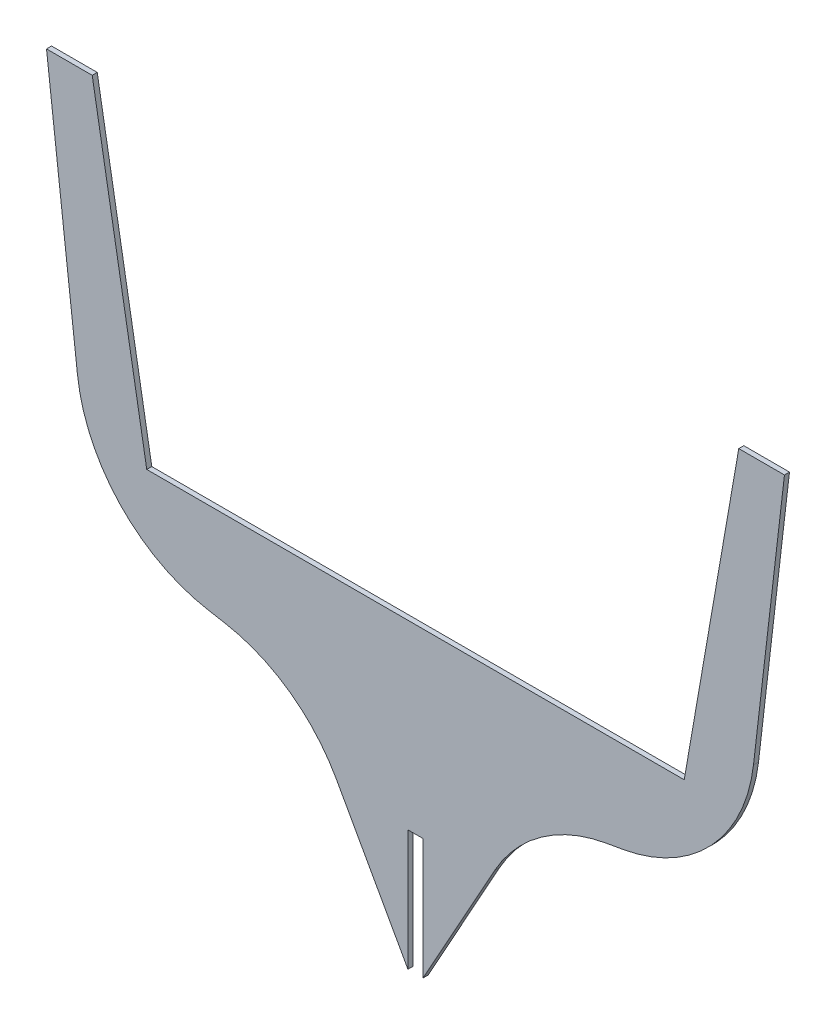
ISO-10303-21;
HEADER;
FILE_DESCRIPTION(('STEP AP214'),'2;1');
FILE_NAME('part.step','',(''),(''),'','','');
FILE_SCHEMA(('AUTOMOTIVE_DESIGN { 1 0 10303 214 1 1 1 1 }'));
ENDSEC;
DATA;
#1=APPLICATION_CONTEXT('core data for automotive mechanical design processes');
#2=APPLICATION_PROTOCOL_DEFINITION('international standard','automotive_design',2000,#1);
#3=PRODUCT_CONTEXT('',#1,'mechanical');
#4=PRODUCT('Part','Part','',(#3));
#5=PRODUCT_RELATED_PRODUCT_CATEGORY('part','',(#4));
#6=PRODUCT_DEFINITION_FORMATION('','',#4);
#7=PRODUCT_DEFINITION_CONTEXT('part definition',#1,'design');
#8=PRODUCT_DEFINITION('design','',#6,#7);
#9=PRODUCT_DEFINITION_SHAPE('','',#8);
#10=(LENGTH_UNIT() NAMED_UNIT(*) SI_UNIT(.MILLI.,.METRE.));
#11=(NAMED_UNIT(*) PLANE_ANGLE_UNIT() SI_UNIT($,.RADIAN.));
#12=(NAMED_UNIT(*) SI_UNIT($,.STERADIAN.) SOLID_ANGLE_UNIT());
#13=UNCERTAINTY_MEASURE_WITH_UNIT(LENGTH_MEASURE(1.E-05),#10,'distance_accuracy_value','');
#14=(GEOMETRIC_REPRESENTATION_CONTEXT(3) GLOBAL_UNCERTAINTY_ASSIGNED_CONTEXT((#13)) GLOBAL_UNIT_ASSIGNED_CONTEXT((#10,
#11,#12)) REPRESENTATION_CONTEXT('',''));
#15=CARTESIAN_POINT('',(0.,0.,0.));
#16=DIRECTION('',(0.,0.,1.));
#17=DIRECTION('',(1.,0.,0.));
#18=AXIS2_PLACEMENT_3D('',#15,#16,#17);
#19=CARTESIAN_POINT('',(209.958428132629,-244.056419552194,3.));
#20=DIRECTION('',(1.,0.,0.));
#21=DIRECTION('',(0.,0.,-1.));
#22=AXIS2_PLACEMENT_3D('',#19,#20,#21);
#23=PLANE('',#22);
#24=DIRECTION('',(0.,-1.,0.));
#25=VECTOR('',#24,1.);
#26=CARTESIAN_POINT('',(209.958428132629,-244.056419552194,0.));
#27=LINE('',#26,#25);
#28=CARTESIAN_POINT('',(209.958428132629,-172.056419552194,0.));
#29=VERTEX_POINT('',#28);
#30=CARTESIAN_POINT('',(209.958428132629,-244.056419552194,0.));
#31=VERTEX_POINT('',#30);
#32=EDGE_CURVE('E184',#29,#31,#27,.T.);
#33=ORIENTED_EDGE('',*,*,#32,.T.);
#34=DIRECTION('',(0.,0.,-1.));
#35=VECTOR('',#34,1.);
#36=CARTESIAN_POINT('',(209.958428132629,-244.056419552194,3.));
#37=LINE('',#36,#35);
#38=CARTESIAN_POINT('',(209.958428132629,-244.056419552194,3.));
#39=VERTEX_POINT('',#38);
#40=EDGE_CURVE('E165',#39,#31,#37,.T.);
#41=ORIENTED_EDGE('',*,*,#40,.F.);
#42=DIRECTION('',(0.,-1.,0.));
#43=VECTOR('',#42,1.);
#44=CARTESIAN_POINT('',(209.958428132629,-244.056419552194,3.));
#45=LINE('',#44,#43);
#46=CARTESIAN_POINT('',(209.958428132629,-172.056419552194,3.));
#47=VERTEX_POINT('',#46);
#48=EDGE_CURVE('E171',#47,#39,#45,.T.);
#49=ORIENTED_EDGE('',*,*,#48,.F.);
#50=DIRECTION('',(0.,0.,-1.));
#51=VECTOR('',#50,1.);
#52=CARTESIAN_POINT('',(209.958428132629,-172.056419552194,3.));
#53=LINE('',#52,#51);
#54=EDGE_CURVE('E252',#47,#29,#53,.T.);
#55=ORIENTED_EDGE('',*,*,#54,.T.);
#56=EDGE_LOOP('',(#33,#41,#49,#55));
#57=FACE_BOUND('',#56,.T.);
#58=ADVANCED_FACE('F35',(#57),#23,.F.);
#59=CARTESIAN_POINT('',(274.580781980399,-127.690915138883,3.));
#60=DIRECTION('',(-0.874237473677519,0.485498547493141,0.));
#61=DIRECTION('',(-0.485498547493141,-0.874237473677519,0.));
#62=AXIS2_PLACEMENT_3D('',#59,#60,#61);
#63=PLANE('',#62);
#64=DIRECTION('',(0.485498547493141,0.874237473677518,0.));
#65=VECTOR('',#64,1.);
#66=CARTESIAN_POINT('',(274.580781980399,-127.690915138883,0.));
#67=LINE('',#66,#65);
#68=CARTESIAN_POINT('',(252.603248255427,-167.265870945839,0.));
#69=VERTEX_POINT('',#68);
#70=EDGE_CURVE('E254',#31,#69,#67,.T.);
#71=ORIENTED_EDGE('',*,*,#70,.T.);
#72=DIRECTION('',(0.,0.,-1.));
#73=VECTOR('',#72,1.);
#74=CARTESIAN_POINT('',(252.603248255427,-167.265870945839,3.));
#75=LINE('',#74,#73);
#76=CARTESIAN_POINT('',(252.603248255427,-167.265870945839,3.));
#77=VERTEX_POINT('',#76);
#78=EDGE_CURVE('E168',#69,#77,#75,.F.);
#79=ORIENTED_EDGE('',*,*,#78,.T.);
#80=DIRECTION('',(0.485498547493141,0.874237473677518,0.));
#81=VECTOR('',#80,1.);
#82=CARTESIAN_POINT('',(274.580781980399,-127.690915138883,3.));
#83=LINE('',#82,#81);
#84=EDGE_CURVE('E160',#39,#77,#83,.T.);
#85=ORIENTED_EDGE('',*,*,#84,.F.);
#86=ORIENTED_EDGE('',*,*,#40,.T.);
#87=EDGE_LOOP('',(#71,#79,#85,#86));
#88=FACE_BOUND('',#87,.T.);
#89=ADVANCED_FACE('F163',(#88),#63,.F.);
#90=CARTESIAN_POINT('',(398.831601009363,-105.784832074239,3.));
#91=DIRECTION('',(-0.173627509558634,0.984811397133718,0.));
#92=DIRECTION('',(-0.984811397133718,-0.173627509558634,0.));
#93=AXIS2_PLACEMENT_3D('',#90,#91,#92);
#94=PLANE('',#93);
#95=DIRECTION('',(0.984811397133718,0.173627509558634,0.));
#96=VECTOR('',#95,1.);
#97=CARTESIAN_POINT('',(398.831601009363,-105.784832074239,0.));
#98=LINE('',#97,#96);
#99=CARTESIAN_POINT('',(319.161194846721,-119.831150229984,0.));
#100=VERTEX_POINT('',#99);
#101=CARTESIAN_POINT('',(329.127406381608,-118.074053903141,0.));
#102=VERTEX_POINT('',#101);
#103=EDGE_CURVE('E256',#100,#102,#98,.T.);
#104=ORIENTED_EDGE('',*,*,#103,.T.);
#105=DIRECTION('',(0.,0.,-1.));
#106=VECTOR('',#105,1.);
#107=CARTESIAN_POINT('',(329.127406381608,-118.074053903141,3.));
#108=LINE('',#107,#106);
#109=CARTESIAN_POINT('',(329.127406381608,-118.074053903141,3.));
#110=VERTEX_POINT('',#109);
#111=EDGE_CURVE('E202',#102,#110,#108,.F.);
#112=ORIENTED_EDGE('',*,*,#111,.T.);
#113=DIRECTION('',(0.984811397133718,0.173627509558634,0.));
#114=VECTOR('',#113,1.);
#115=CARTESIAN_POINT('',(398.831601009363,-105.784832074239,3.));
#116=LINE('',#115,#114);
#117=CARTESIAN_POINT('',(319.161194846721,-119.831150229984,3.));
#118=VERTEX_POINT('',#117);
#119=EDGE_CURVE('E170',#118,#110,#116,.T.);
#120=ORIENTED_EDGE('',*,*,#119,.F.);
#121=DIRECTION('',(0.,0.,-1.));
#122=VECTOR('',#121,1.);
#123=CARTESIAN_POINT('',(319.161194846721,-119.831150229984,0.));
#124=LINE('',#123,#122);
#125=EDGE_CURVE('E199',#118,#100,#124,.T.);
#126=ORIENTED_EDGE('',*,*,#125,.T.);
#127=EDGE_LOOP('',(#104,#112,#120,#126));
#128=FACE_BOUND('',#127,.T.);
#129=ADVANCED_FACE('F347',(#128),#94,.F.);
#130=CARTESIAN_POINT('',(425.458428132629,123.443580447806,3.));
#131=DIRECTION('',(-0.993321114307734,0.115382684448063,0.));
#132=DIRECTION('',(-0.115382684448063,-0.993321114307734,0.));
#133=AXIS2_PLACEMENT_3D('',#130,#131,#132);
#134=PLANE('',#133);
#135=DIRECTION('',(0.115382684448063,0.993321114307734,0.));
#136=VECTOR('',#135,1.);
#137=CARTESIAN_POINT('',(425.458428132629,123.443580447806,3.));
#138=LINE('',#137,#136);
#139=CARTESIAN_POINT('',(406.998298832773,-35.4783261980038,3.));
#140=VERTEX_POINT('',#139);
#141=CARTESIAN_POINT('',(425.458428132629,123.443580447806,3.));
#142=VERTEX_POINT('',#141);
#143=EDGE_CURVE('E508',#140,#142,#138,.T.);
#144=ORIENTED_EDGE('',*,*,#143,.F.);
#145=DIRECTION('',(0.,0.,-1.));
#146=VECTOR('',#145,1.);
#147=CARTESIAN_POINT('',(406.998298832773,-35.4783261980038,3.));
#148=LINE('',#147,#146);
#149=CARTESIAN_POINT('',(406.998298832773,-35.4783261980038,0.));
#150=VERTEX_POINT('',#149);
#151=EDGE_CURVE('E185',#140,#150,#148,.T.);
#152=ORIENTED_EDGE('',*,*,#151,.T.);
#153=DIRECTION('',(0.115382684448063,0.993321114307734,0.));
#154=VECTOR('',#153,1.);
#155=CARTESIAN_POINT('',(425.458428132629,123.443580447806,0.));
#156=LINE('',#155,#154);
#157=CARTESIAN_POINT('',(425.458428132629,123.443580447806,0.));
#158=VERTEX_POINT('',#157);
#159=EDGE_CURVE('E259',#150,#158,#156,.T.);
#160=ORIENTED_EDGE('',*,*,#159,.T.);
#161=DIRECTION('',(0.,0.,-1.));
#162=VECTOR('',#161,1.);
#163=CARTESIAN_POINT('',(425.458428132629,123.443580447806,3.));
#164=LINE('',#163,#162);
#165=EDGE_CURVE('E186',#142,#158,#164,.T.);
#166=ORIENTED_EDGE('',*,*,#165,.F.);
#167=EDGE_LOOP('',(#144,#152,#160,#166));
#168=FACE_BOUND('',#167,.T.);
#169=ADVANCED_FACE('F430',(#168),#134,.F.);
#170=CARTESIAN_POINT('',(425.458428132629,123.443580447806,3.));
#171=DIRECTION('',(0.,-1.,0.));
#172=DIRECTION('',(1.,0.,0.));
#173=AXIS2_PLACEMENT_3D('',#170,#171,#172);
#174=PLANE('',#173);
#175=DIRECTION('',(-1.,0.,0.));
#176=VECTOR('',#175,1.);
#177=CARTESIAN_POINT('',(425.458428132629,123.443580447806,0.));
#178=LINE('',#177,#176);
#179=CARTESIAN_POINT('',(398.210919070476,123.443580447806,0.));
#180=VERTEX_POINT('',#179);
#181=EDGE_CURVE('E261',#158,#180,#178,.T.);
#182=ORIENTED_EDGE('',*,*,#181,.T.);
#183=DIRECTION('',(0.,0.,-1.));
#184=VECTOR('',#183,1.);
#185=CARTESIAN_POINT('',(398.210919070476,123.443580447806,3.));
#186=LINE('',#185,#184);
#187=CARTESIAN_POINT('',(398.210919070476,123.443580447806,3.));
#188=VERTEX_POINT('',#187);
#189=EDGE_CURVE('E192',#188,#180,#186,.T.);
#190=ORIENTED_EDGE('',*,*,#189,.F.);
#191=DIRECTION('',(-1.,0.,0.));
#192=VECTOR('',#191,1.);
#193=CARTESIAN_POINT('',(425.458428132629,123.443580447806,3.));
#194=LINE('',#193,#192);
#195=EDGE_CURVE('E506',#142,#188,#194,.T.);
#196=ORIENTED_EDGE('',*,*,#195,.F.);
#197=ORIENTED_EDGE('',*,*,#165,.T.);
#198=EDGE_LOOP('',(#182,#190,#196,#197));
#199=FACE_BOUND('',#198,.T.);
#200=ADVANCED_FACE('F435',(#199),#174,.F.);
#201=CARTESIAN_POINT('',(398.210919070476,123.443580447806,3.));
#202=DIRECTION('',(0.985248404363814,-0.171130306195482,0.));
#203=DIRECTION('',(0.171130306195482,0.985248404363814,0.));
#204=AXIS2_PLACEMENT_3D('',#201,#202,#203);
#205=PLANE('',#204);
#206=DIRECTION('',(-0.171130306195482,-0.985248404363813,0.));
#207=VECTOR('',#206,1.);
#208=CARTESIAN_POINT('',(398.210919070476,123.443580447806,0.));
#209=LINE('',#208,#207);
#210=CARTESIAN_POINT('',(365.682670580279,-63.8312841521944,0.));
#211=VERTEX_POINT('',#210);
#212=EDGE_CURVE('E263',#180,#211,#209,.T.);
#213=ORIENTED_EDGE('',*,*,#212,.T.);
#214=DIRECTION('',(0.,0.,-1.));
#215=VECTOR('',#214,1.);
#216=CARTESIAN_POINT('',(365.682670580279,-63.8312841521944,3.));
#217=LINE('',#216,#215);
#218=CARTESIAN_POINT('',(365.682670580279,-63.8312841521944,3.));
#219=VERTEX_POINT('',#218);
#220=EDGE_CURVE('E291',#219,#211,#217,.T.);
#221=ORIENTED_EDGE('',*,*,#220,.F.);
#222=DIRECTION('',(-0.171130306195482,-0.985248404363813,0.));
#223=VECTOR('',#222,1.);
#224=CARTESIAN_POINT('',(398.210919070476,123.443580447806,3.));
#225=LINE('',#224,#223);
#226=EDGE_CURVE('E300',#188,#219,#225,.T.);
#227=ORIENTED_EDGE('',*,*,#226,.F.);
#228=ORIENTED_EDGE('',*,*,#189,.T.);
#229=EDGE_LOOP('',(#213,#221,#227,#228));
#230=FACE_BOUND('',#229,.T.);
#231=ADVANCED_FACE('F298',(#230),#205,.F.);
#232=CARTESIAN_POINT('',(45.2341856849782,-63.8312841521944,3.));
#233=DIRECTION('',(0.,-1.,0.));
#234=DIRECTION('',(0.,0.,-1.));
#235=AXIS2_PLACEMENT_3D('',#232,#233,#234);
#236=PLANE('',#235);
#237=DIRECTION('',(-1.,0.,0.));
#238=VECTOR('',#237,1.);
#239=CARTESIAN_POINT('',(45.2341856849782,-63.8312841521944,0.));
#240=LINE('',#239,#238);
#241=CARTESIAN_POINT('',(45.2341856849782,-63.8312841521944,0.));
#242=VERTEX_POINT('',#241);
#243=EDGE_CURVE('E265',#211,#242,#240,.T.);
#244=ORIENTED_EDGE('',*,*,#243,.T.);
#245=DIRECTION('',(0.,0.,-1.));
#246=VECTOR('',#245,1.);
#247=CARTESIAN_POINT('',(45.2341856849782,-63.8312841521944,3.));
#248=LINE('',#247,#246);
#249=CARTESIAN_POINT('',(45.2341856849782,-63.8312841521944,3.));
#250=VERTEX_POINT('',#249);
#251=EDGE_CURVE('E288',#250,#242,#248,.T.);
#252=ORIENTED_EDGE('',*,*,#251,.F.);
#253=DIRECTION('',(-1.,0.,0.));
#254=VECTOR('',#253,1.);
#255=CARTESIAN_POINT('',(45.2341856849782,-63.8312841521944,3.));
#256=LINE('',#255,#254);
#257=EDGE_CURVE('E318',#219,#250,#256,.T.);
#258=ORIENTED_EDGE('',*,*,#257,.F.);
#259=ORIENTED_EDGE('',*,*,#220,.T.);
#260=EDGE_LOOP('',(#244,#252,#258,#259));
#261=FACE_BOUND('',#260,.T.);
#262=ADVANCED_FACE('F309',(#261),#236,.F.);
#263=CARTESIAN_POINT('',(12.705937194782,123.443580447806,3.));
#264=DIRECTION('',(-0.985248404363814,-0.171130306195482,0.));
#265=DIRECTION('',(0.171130306195482,-0.985248404363814,0.));
#266=AXIS2_PLACEMENT_3D('',#263,#264,#265);
#267=PLANE('',#266);
#268=DIRECTION('',(-0.171130306195482,0.985248404363813,0.));
#269=VECTOR('',#268,1.);
#270=CARTESIAN_POINT('',(12.705937194782,123.443580447806,0.));
#271=LINE('',#270,#269);
#272=CARTESIAN_POINT('',(12.705937194782,123.443580447806,0.));
#273=VERTEX_POINT('',#272);
#274=EDGE_CURVE('E267',#242,#273,#271,.T.);
#275=ORIENTED_EDGE('',*,*,#274,.T.);
#276=DIRECTION('',(0.,0.,-1.));
#277=VECTOR('',#276,1.);
#278=CARTESIAN_POINT('',(12.705937194782,123.443580447806,3.));
#279=LINE('',#278,#277);
#280=CARTESIAN_POINT('',(12.705937194782,123.443580447806,3.));
#281=VERTEX_POINT('',#280);
#282=EDGE_CURVE('E285',#281,#273,#279,.T.);
#283=ORIENTED_EDGE('',*,*,#282,.F.);
#284=DIRECTION('',(-0.171130306195482,0.985248404363813,0.));
#285=VECTOR('',#284,1.);
#286=CARTESIAN_POINT('',(12.705937194782,123.443580447806,3.));
#287=LINE('',#286,#285);
#288=EDGE_CURVE('E315',#250,#281,#287,.T.);
#289=ORIENTED_EDGE('',*,*,#288,.F.);
#290=ORIENTED_EDGE('',*,*,#251,.T.);
#291=EDGE_LOOP('',(#275,#283,#289,#290));
#292=FACE_BOUND('',#291,.T.);
#293=ADVANCED_FACE('F313',(#292),#267,.F.);
#294=CARTESIAN_POINT('',(-14.5415718673713,123.443580447806,3.));
#295=DIRECTION('',(0.,-1.,0.));
#296=DIRECTION('',(1.,0.,0.));
#297=AXIS2_PLACEMENT_3D('',#294,#295,#296);
#298=PLANE('',#297);
#299=DIRECTION('',(-1.,0.,0.));
#300=VECTOR('',#299,1.);
#301=CARTESIAN_POINT('',(-14.5415718673713,123.443580447806,0.));
#302=LINE('',#301,#300);
#303=CARTESIAN_POINT('',(-14.5415718673713,123.443580447806,0.));
#304=VERTEX_POINT('',#303);
#305=EDGE_CURVE('E269',#273,#304,#302,.T.);
#306=ORIENTED_EDGE('',*,*,#305,.T.);
#307=DIRECTION('',(0.,0.,-1.));
#308=VECTOR('',#307,1.);
#309=CARTESIAN_POINT('',(-14.5415718673713,123.443580447806,3.));
#310=LINE('',#309,#308);
#311=CARTESIAN_POINT('',(-14.5415718673713,123.443580447806,3.));
#312=VERTEX_POINT('',#311);
#313=EDGE_CURVE('E282',#312,#304,#310,.T.);
#314=ORIENTED_EDGE('',*,*,#313,.F.);
#315=DIRECTION('',(-1.,0.,0.));
#316=VECTOR('',#315,1.);
#317=CARTESIAN_POINT('',(-14.5415718673713,123.443580447806,3.));
#318=LINE('',#317,#316);
#319=EDGE_CURVE('E317',#281,#312,#318,.T.);
#320=ORIENTED_EDGE('',*,*,#319,.F.);
#321=ORIENTED_EDGE('',*,*,#282,.T.);
#322=EDGE_LOOP('',(#306,#314,#320,#321));
#323=FACE_BOUND('',#322,.T.);
#324=ADVANCED_FACE('F333',(#323),#298,.F.);
#325=CARTESIAN_POINT('',(-14.5415718673713,123.443580447806,3.));
#326=DIRECTION('',(0.993321114307734,0.115382684448064,0.));
#327=DIRECTION('',(-0.115382684448064,0.993321114307734,0.));
#328=AXIS2_PLACEMENT_3D('',#325,#326,#327);
#329=PLANE('',#328);
#330=DIRECTION('',(0.115382684448064,-0.993321114307734,0.));
#331=VECTOR('',#330,1.);
#332=CARTESIAN_POINT('',(-14.5415718673713,123.443580447806,0.));
#333=LINE('',#332,#331);
#334=CARTESIAN_POINT('',(3.91855743248498,-35.4783261980039,0.));
#335=VERTEX_POINT('',#334);
#336=EDGE_CURVE('E233',#304,#335,#333,.T.);
#337=ORIENTED_EDGE('',*,*,#336,.T.);
#338=DIRECTION('',(0.,0.,-1.));
#339=VECTOR('',#338,1.);
#340=CARTESIAN_POINT('',(3.91855743248498,-35.4783261980038,3.));
#341=LINE('',#340,#339);
#342=CARTESIAN_POINT('',(3.91855743248498,-35.4783261980039,3.));
#343=VERTEX_POINT('',#342);
#344=EDGE_CURVE('E216',#335,#343,#341,.F.);
#345=ORIENTED_EDGE('',*,*,#344,.T.);
#346=DIRECTION('',(0.115382684448064,-0.993321114307734,0.));
#347=VECTOR('',#346,1.);
#348=CARTESIAN_POINT('',(-14.5415718673713,123.443580447806,3.));
#349=LINE('',#348,#347);
#350=EDGE_CURVE('E247',#312,#343,#349,.T.);
#351=ORIENTED_EDGE('',*,*,#350,.F.);
#352=ORIENTED_EDGE('',*,*,#313,.T.);
#353=EDGE_LOOP('',(#337,#345,#351,#352));
#354=FACE_BOUND('',#353,.T.);
#355=ADVANCED_FACE('F331',(#354),#329,.F.);
#356=CARTESIAN_POINT('',(12.0852552558944,-105.784832074239,3.));
#357=DIRECTION('',(0.173627509558634,0.984811397133718,0.));
#358=DIRECTION('',(-0.984811397133718,0.173627509558634,0.));
#359=AXIS2_PLACEMENT_3D('',#356,#357,#358);
#360=PLANE('',#359);
#361=DIRECTION('',(0.984811397133718,-0.173627509558634,0.));
#362=VECTOR('',#361,1.);
#363=CARTESIAN_POINT('',(12.0852552558944,-105.784832074239,0.));
#364=LINE('',#363,#362);
#365=CARTESIAN_POINT('',(81.7894498836495,-118.074053903141,0.));
#366=VERTEX_POINT('',#365);
#367=CARTESIAN_POINT('',(91.7556614185369,-119.831150229984,0.));
#368=VERTEX_POINT('',#367);
#369=EDGE_CURVE('E226',#366,#368,#364,.T.);
#370=ORIENTED_EDGE('',*,*,#369,.T.);
#371=DIRECTION('',(0.,0.,-1.));
#372=VECTOR('',#371,1.);
#373=CARTESIAN_POINT('',(91.7556614185369,-119.831150229984,3.));
#374=LINE('',#373,#372);
#375=CARTESIAN_POINT('',(91.7556614185369,-119.831150229984,3.));
#376=VERTEX_POINT('',#375);
#377=EDGE_CURVE('E56',#368,#376,#374,.F.);
#378=ORIENTED_EDGE('',*,*,#377,.T.);
#379=DIRECTION('',(0.984811397133718,-0.173627509558634,0.));
#380=VECTOR('',#379,1.);
#381=CARTESIAN_POINT('',(12.0852552558944,-105.784832074239,3.));
#382=LINE('',#381,#380);
#383=CARTESIAN_POINT('',(81.7894498836495,-118.074053903141,3.));
#384=VERTEX_POINT('',#383);
#385=EDGE_CURVE('E244',#384,#376,#382,.T.);
#386=ORIENTED_EDGE('',*,*,#385,.F.);
#387=DIRECTION('',(0.,0.,-1.));
#388=VECTOR('',#387,1.);
#389=CARTESIAN_POINT('',(81.7894498836495,-118.074053903141,3.));
#390=LINE('',#389,#388);
#391=EDGE_CURVE('E212',#384,#366,#390,.T.);
#392=ORIENTED_EDGE('',*,*,#391,.T.);
#393=EDGE_LOOP('',(#370,#378,#386,#392));
#394=FACE_BOUND('',#393,.T.);
#395=ADVANCED_FACE('F231',(#394),#360,.F.);
#396=CARTESIAN_POINT('',(136.336074284858,-127.690915138883,3.));
#397=DIRECTION('',(0.874237473677518,0.485498547493142,0.));
#398=DIRECTION('',(-0.485498547493142,0.874237473677518,0.));
#399=AXIS2_PLACEMENT_3D('',#396,#397,#398);
#400=PLANE('',#399);
#401=DIRECTION('',(0.485498547493142,-0.874237473677518,0.));
#402=VECTOR('',#401,1.);
#403=CARTESIAN_POINT('',(136.336074284858,-127.690915138883,3.));
#404=LINE('',#403,#402);
#405=CARTESIAN_POINT('',(158.313608009831,-167.265870945839,3.));
#406=VERTEX_POINT('',#405);
#407=CARTESIAN_POINT('',(200.958428132629,-244.056419552194,3.));
#408=VERTEX_POINT('',#407);
#409=EDGE_CURVE('E240',#406,#408,#404,.T.);
#410=ORIENTED_EDGE('',*,*,#409,.F.);
#411=DIRECTION('',(0.,0.,-1.));
#412=VECTOR('',#411,1.);
#413=CARTESIAN_POINT('',(158.313608009831,-167.265870945839,0.));
#414=LINE('',#413,#412);
#415=CARTESIAN_POINT('',(158.313608009831,-167.265870945839,0.));
#416=VERTEX_POINT('',#415);
#417=EDGE_CURVE('E209',#406,#416,#414,.T.);
#418=ORIENTED_EDGE('',*,*,#417,.T.);
#419=DIRECTION('',(0.485498547493142,-0.874237473677518,0.));
#420=VECTOR('',#419,1.);
#421=CARTESIAN_POINT('',(136.336074284858,-127.690915138883,0.));
#422=LINE('',#421,#420);
#423=CARTESIAN_POINT('',(200.958428132629,-244.056419552194,0.));
#424=VERTEX_POINT('',#423);
#425=EDGE_CURVE('E228',#416,#424,#422,.T.);
#426=ORIENTED_EDGE('',*,*,#425,.T.);
#427=DIRECTION('',(0.,0.,-1.));
#428=VECTOR('',#427,1.);
#429=CARTESIAN_POINT('',(200.958428132629,-244.056419552194,3.));
#430=LINE('',#429,#428);
#431=EDGE_CURVE('E241',#408,#424,#430,.T.);
#432=ORIENTED_EDGE('',*,*,#431,.F.);
#433=EDGE_LOOP('',(#410,#418,#426,#432));
#434=FACE_BOUND('',#433,.T.);
#435=ADVANCED_FACE('F237',(#434),#400,.F.);
#436=CARTESIAN_POINT('',(200.958428132629,-244.056419552194,3.));
#437=DIRECTION('',(-1.,0.,0.));
#438=DIRECTION('',(0.,0.,1.));
#439=AXIS2_PLACEMENT_3D('',#436,#437,#438);
#440=PLANE('',#439);
#441=DIRECTION('',(0.,1.,0.));
#442=VECTOR('',#441,1.);
#443=CARTESIAN_POINT('',(200.958428132629,-244.056419552194,0.));
#444=LINE('',#443,#442);
#445=CARTESIAN_POINT('',(200.958428132629,-172.056419552194,0.));
#446=VERTEX_POINT('',#445);
#447=EDGE_CURVE('E274',#424,#446,#444,.T.);
#448=ORIENTED_EDGE('',*,*,#447,.T.);
#449=DIRECTION('',(0.,0.,-1.));
#450=VECTOR('',#449,1.);
#451=CARTESIAN_POINT('',(200.958428132629,-172.056419552194,3.));
#452=LINE('',#451,#450);
#453=CARTESIAN_POINT('',(200.958428132629,-172.056419552194,3.));
#454=VERTEX_POINT('',#453);
#455=EDGE_CURVE('E278',#454,#446,#452,.T.);
#456=ORIENTED_EDGE('',*,*,#455,.F.);
#457=DIRECTION('',(0.,1.,0.));
#458=VECTOR('',#457,1.);
#459=CARTESIAN_POINT('',(200.958428132629,-244.056419552194,3.));
#460=LINE('',#459,#458);
#461=EDGE_CURVE('E243',#408,#454,#460,.T.);
#462=ORIENTED_EDGE('',*,*,#461,.F.);
#463=ORIENTED_EDGE('',*,*,#431,.T.);
#464=EDGE_LOOP('',(#448,#456,#462,#463));
#465=FACE_BOUND('',#464,.T.);
#466=ADVANCED_FACE('F408',(#465),#440,.F.);
#467=CARTESIAN_POINT('',(200.958428132629,-172.056419552194,3.));
#468=DIRECTION('',(0.,1.,0.));
#469=DIRECTION('',(0.,0.,1.));
#470=AXIS2_PLACEMENT_3D('',#467,#468,#469);
#471=PLANE('',#470);
#472=DIRECTION('',(1.,0.,0.));
#473=VECTOR('',#472,1.);
#474=CARTESIAN_POINT('',(200.958428132629,-172.056419552194,0.));
#475=LINE('',#474,#473);
#476=EDGE_CURVE('E181',#446,#29,#475,.T.);
#477=ORIENTED_EDGE('',*,*,#476,.T.);
#478=ORIENTED_EDGE('',*,*,#54,.F.);
#479=DIRECTION('',(1.,0.,0.));
#480=VECTOR('',#479,1.);
#481=CARTESIAN_POINT('',(200.958428132629,-172.056419552194,3.));
#482=LINE('',#481,#480);
#483=EDGE_CURVE('E177',#454,#47,#482,.T.);
#484=ORIENTED_EDGE('',*,*,#483,.F.);
#485=ORIENTED_EDGE('',*,*,#455,.T.);
#486=EDGE_LOOP('',(#477,#478,#484,#485));
#487=FACE_BOUND('',#486,.T.);
#488=ADVANCED_FACE('F397',(#487),#471,.F.);
#489=CARTESIAN_POINT('',(0.,0.,3.));
#490=DIRECTION('',(0.,0.,-1.));
#491=DIRECTION('',(-1.,0.,0.));
#492=AXIS2_PLACEMENT_3D('',#489,#490,#491);
#493=PLANE('',#492);
#494=ORIENTED_EDGE('',*,*,#119,.T.);
#495=CARTESIAN_POINT('',(312.632792973538,-24.5169711754377,3.));
#496=DIRECTION('',(0.,0.,-1.));
#497=DIRECTION('',(-1.,0.,0.));
#498=AXIS2_PLACEMENT_3D('',#495,#496,#497);
#499=CIRCLE('',#498,95.);
#500=EDGE_CURVE('E206',#110,#140,#499,.F.);
#501=ORIENTED_EDGE('',*,*,#500,.T.);
#502=ORIENTED_EDGE('',*,*,#143,.T.);
#503=ORIENTED_EDGE('',*,*,#195,.T.);
#504=ORIENTED_EDGE('',*,*,#226,.T.);
#505=ORIENTED_EDGE('',*,*,#257,.T.);
#506=ORIENTED_EDGE('',*,*,#288,.T.);
#507=ORIENTED_EDGE('',*,*,#319,.T.);
#508=ORIENTED_EDGE('',*,*,#350,.T.);
#509=CARTESIAN_POINT('',(98.2840632917197,-24.5169711754378,3.));
#510=DIRECTION('',(0.,0.,-1.));
#511=DIRECTION('',(-1.,0.,0.));
#512=AXIS2_PLACEMENT_3D('',#509,#510,#511);
#513=CIRCLE('',#512,95.);
#514=EDGE_CURVE('E204',#343,#384,#513,.F.);
#515=ORIENTED_EDGE('',*,*,#514,.T.);
#516=ORIENTED_EDGE('',*,*,#385,.T.);
#517=CARTESIAN_POINT('',(75.2610480104668,-213.388232957688,3.));
#518=DIRECTION('',(0.,0.,-1.));
#519=DIRECTION('',(-1.,0.,0.));
#520=AXIS2_PLACEMENT_3D('',#517,#518,#519);
#521=CIRCLE('',#520,95.);
#522=EDGE_CURVE('E11',#376,#406,#521,.T.);
#523=ORIENTED_EDGE('',*,*,#522,.T.);
#524=ORIENTED_EDGE('',*,*,#409,.T.);
#525=ORIENTED_EDGE('',*,*,#461,.T.);
#526=ORIENTED_EDGE('',*,*,#483,.T.);
#527=ORIENTED_EDGE('',*,*,#48,.T.);
#528=ORIENTED_EDGE('',*,*,#84,.T.);
#529=CARTESIAN_POINT('',(335.655808254791,-213.388232957688,3.));
#530=DIRECTION('',(0.,0.,-1.));
#531=DIRECTION('',(-1.,0.,0.));
#532=AXIS2_PLACEMENT_3D('',#529,#530,#531);
#533=CIRCLE('',#532,95.);
#534=EDGE_CURVE('E220',#77,#118,#533,.T.);
#535=ORIENTED_EDGE('',*,*,#534,.T.);
#536=EDGE_LOOP('',(#494,#501,#502,#503,#504,#505,#506,#507,#508,#515,#516,#523,#524,#525,#526,
#527,#528,#535));
#537=FACE_BOUND('',#536,.T.);
#538=ADVANCED_FACE('F175',(#537),#493,.F.);
#539=CARTESIAN_POINT('',(0.,0.,0.));
#540=DIRECTION('',(0.,0.,-1.));
#541=DIRECTION('',(-1.,0.,0.));
#542=AXIS2_PLACEMENT_3D('',#539,#540,#541);
#543=PLANE('',#542);
#544=ORIENTED_EDGE('',*,*,#159,.F.);
#545=CARTESIAN_POINT('',(312.632792973538,-24.5169711754377,0.));
#546=DIRECTION('',(0.,0.,-1.));
#547=DIRECTION('',(-1.,0.,0.));
#548=AXIS2_PLACEMENT_3D('',#545,#546,#547);
#549=CIRCLE('',#548,95.);
#550=EDGE_CURVE('E197',#150,#102,#549,.T.);
#551=ORIENTED_EDGE('',*,*,#550,.T.);
#552=ORIENTED_EDGE('',*,*,#103,.F.);
#553=CARTESIAN_POINT('',(335.655808254791,-213.388232957688,0.));
#554=DIRECTION('',(0.,0.,-1.));
#555=DIRECTION('',(-1.,0.,0.));
#556=AXIS2_PLACEMENT_3D('',#553,#554,#555);
#557=CIRCLE('',#556,95.);
#558=EDGE_CURVE('E218',#100,#69,#557,.F.);
#559=ORIENTED_EDGE('',*,*,#558,.T.);
#560=ORIENTED_EDGE('',*,*,#70,.F.);
#561=ORIENTED_EDGE('',*,*,#32,.F.);
#562=ORIENTED_EDGE('',*,*,#476,.F.);
#563=ORIENTED_EDGE('',*,*,#447,.F.);
#564=ORIENTED_EDGE('',*,*,#425,.F.);
#565=CARTESIAN_POINT('',(75.2610480104668,-213.388232957688,0.));
#566=DIRECTION('',(0.,0.,-1.));
#567=DIRECTION('',(-1.,0.,0.));
#568=AXIS2_PLACEMENT_3D('',#565,#566,#567);
#569=CIRCLE('',#568,95.);
#570=EDGE_CURVE('E43',#416,#368,#569,.F.);
#571=ORIENTED_EDGE('',*,*,#570,.T.);
#572=ORIENTED_EDGE('',*,*,#369,.F.);
#573=CARTESIAN_POINT('',(98.2840632917197,-24.5169711754378,0.));
#574=DIRECTION('',(0.,0.,-1.));
#575=DIRECTION('',(-1.,0.,0.));
#576=AXIS2_PLACEMENT_3D('',#573,#574,#575);
#577=CIRCLE('',#576,95.);
#578=EDGE_CURVE('E189',#366,#335,#577,.T.);
#579=ORIENTED_EDGE('',*,*,#578,.T.);
#580=ORIENTED_EDGE('',*,*,#336,.F.);
#581=ORIENTED_EDGE('',*,*,#305,.F.);
#582=ORIENTED_EDGE('',*,*,#274,.F.);
#583=ORIENTED_EDGE('',*,*,#243,.F.);
#584=ORIENTED_EDGE('',*,*,#212,.F.);
#585=ORIENTED_EDGE('',*,*,#181,.F.);
#586=EDGE_LOOP('',(#544,#551,#552,#559,#560,#561,#562,#563,#564,#571,#572,#579,#580,#581,#582,
#583,#584,#585));
#587=FACE_BOUND('',#586,.T.);
#588=ADVANCED_FACE('F225',(#587),#543,.T.);
#589=CARTESIAN_POINT('',(312.632792973538,-24.5169711754377,3.));
#590=DIRECTION('',(0.,0.,-1.));
#591=DIRECTION('',(-1.,0.,0.));
#592=AXIS2_PLACEMENT_3D('',#589,#590,#591);
#593=CYLINDRICAL_SURFACE('',#592,95.);
#594=ORIENTED_EDGE('',*,*,#500,.F.);
#595=ORIENTED_EDGE('',*,*,#111,.F.);
#596=ORIENTED_EDGE('',*,*,#550,.F.);
#597=ORIENTED_EDGE('',*,*,#151,.F.);
#598=EDGE_LOOP('',(#594,#595,#596,#597));
#599=FACE_BOUND('',#598,.T.);
#600=ADVANCED_FACE('F351',(#599),#593,.T.);
#601=CARTESIAN_POINT('',(335.655808254791,-213.388232957688,3.));
#602=DIRECTION('',(0.,0.,1.));
#603=DIRECTION('',(1.,0.,0.));
#604=AXIS2_PLACEMENT_3D('',#601,#602,#603);
#605=CYLINDRICAL_SURFACE('',#604,95.);
#606=ORIENTED_EDGE('',*,*,#534,.F.);
#607=ORIENTED_EDGE('',*,*,#78,.F.);
#608=ORIENTED_EDGE('',*,*,#558,.F.);
#609=ORIENTED_EDGE('',*,*,#125,.F.);
#610=EDGE_LOOP('',(#606,#607,#608,#609));
#611=FACE_BOUND('',#610,.T.);
#612=ADVANCED_FACE('F354',(#611),#605,.F.);
#613=CARTESIAN_POINT('',(75.2610480104668,-213.388232957688,3.));
#614=DIRECTION('',(0.,0.,1.));
#615=DIRECTION('',(1.,0.,0.));
#616=AXIS2_PLACEMENT_3D('',#613,#614,#615);
#617=CYLINDRICAL_SURFACE('',#616,95.);
#618=ORIENTED_EDGE('',*,*,#522,.F.);
#619=ORIENTED_EDGE('',*,*,#377,.F.);
#620=ORIENTED_EDGE('',*,*,#570,.F.);
#621=ORIENTED_EDGE('',*,*,#417,.F.);
#622=EDGE_LOOP('',(#618,#619,#620,#621));
#623=FACE_BOUND('',#622,.T.);
#624=ADVANCED_FACE('F235',(#623),#617,.F.);
#625=CARTESIAN_POINT('',(98.2840632917197,-24.5169711754378,3.));
#626=DIRECTION('',(0.,0.,-1.));
#627=DIRECTION('',(-1.,0.,0.));
#628=AXIS2_PLACEMENT_3D('',#625,#626,#627);
#629=CYLINDRICAL_SURFACE('',#628,95.);
#630=ORIENTED_EDGE('',*,*,#514,.F.);
#631=ORIENTED_EDGE('',*,*,#344,.F.);
#632=ORIENTED_EDGE('',*,*,#578,.F.);
#633=ORIENTED_EDGE('',*,*,#391,.F.);
#634=EDGE_LOOP('',(#630,#631,#632,#633));
#635=FACE_BOUND('',#634,.T.);
#636=ADVANCED_FACE('F37',(#635),#629,.T.);
#637=CLOSED_SHELL('',(#58,#89,#129,#169,#200,#231,#262,#293,#324,#355,#395,#435,#466,#488,#538,
#588,#600,#612,#624,#636));
#638=MANIFOLD_SOLID_BREP('B2',#637);
#639=ADVANCED_BREP_SHAPE_REPRESENTATION('',(#18,#638),#14);
#640=SHAPE_DEFINITION_REPRESENTATION(#9,#639);
ENDSEC;
END-ISO-10303-21;
